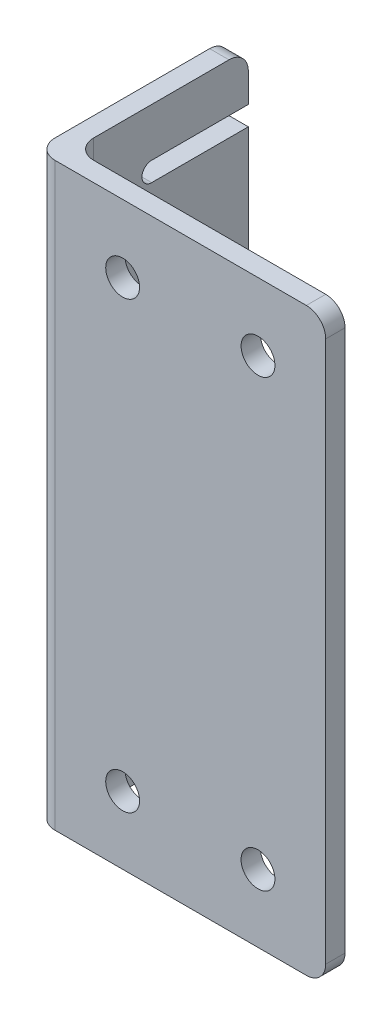
ISO-10303-21;
HEADER;
FILE_DESCRIPTION(('STEP AP214'),'2;1');
FILE_NAME('part.step','',(''),(''),'','','');
FILE_SCHEMA(('AUTOMOTIVE_DESIGN { 1 0 10303 214 1 1 1 1 }'));
ENDSEC;
DATA;
#1=APPLICATION_CONTEXT('core data for automotive mechanical design processes');
#2=APPLICATION_PROTOCOL_DEFINITION('international standard','automotive_design',2000,#1);
#3=PRODUCT_CONTEXT('',#1,'mechanical');
#4=PRODUCT('Part','Part','',(#3));
#5=PRODUCT_RELATED_PRODUCT_CATEGORY('part','',(#4));
#6=PRODUCT_DEFINITION_FORMATION('','',#4);
#7=PRODUCT_DEFINITION_CONTEXT('part definition',#1,'design');
#8=PRODUCT_DEFINITION('design','',#6,#7);
#9=PRODUCT_DEFINITION_SHAPE('','',#8);
#10=(LENGTH_UNIT() NAMED_UNIT(*) SI_UNIT(.MILLI.,.METRE.));
#11=(NAMED_UNIT(*) PLANE_ANGLE_UNIT() SI_UNIT($,.RADIAN.));
#12=(NAMED_UNIT(*) SI_UNIT($,.STERADIAN.) SOLID_ANGLE_UNIT());
#13=UNCERTAINTY_MEASURE_WITH_UNIT(LENGTH_MEASURE(1.E-05),#10,'distance_accuracy_value','');
#14=(GEOMETRIC_REPRESENTATION_CONTEXT(3) GLOBAL_UNCERTAINTY_ASSIGNED_CONTEXT((#13)) GLOBAL_UNIT_ASSIGNED_CONTEXT((#10,
#11,#12)) REPRESENTATION_CONTEXT('',''));
#15=CARTESIAN_POINT('',(0.,0.,0.));
#16=DIRECTION('',(0.,0.,1.));
#17=DIRECTION('',(1.,0.,0.));
#18=AXIS2_PLACEMENT_3D('',#15,#16,#17);
#19=CARTESIAN_POINT('',(0.,60.,-20.));
#20=DIRECTION('',(0.,0.,1.));
#21=DIRECTION('',(1.,0.,0.));
#22=AXIS2_PLACEMENT_3D('',#19,#20,#21);
#23=PLANE('',#22);
#24=DIRECTION('',(0.,-1.,0.));
#25=VECTOR('',#24,1.);
#26=CARTESIAN_POINT('',(0.,60.,-20.));
#27=LINE('',#26,#25);
#28=CARTESIAN_POINT('',(0.,58.,-20.));
#29=VERTEX_POINT('',#28);
#30=CARTESIAN_POINT('',(0.,55.,-20.));
#31=VERTEX_POINT('',#30);
#32=EDGE_CURVE('E299',#29,#31,#27,.T.);
#33=ORIENTED_EDGE('',*,*,#32,.F.);
#34=DIRECTION('',(-1.,0.,0.));
#35=VECTOR('',#34,1.);
#36=CARTESIAN_POINT('',(0.,58.,-20.));
#37=LINE('',#36,#35);
#38=CARTESIAN_POINT('',(2.,58.,-20.));
#39=VERTEX_POINT('',#38);
#40=EDGE_CURVE('E378',#29,#39,#37,.F.);
#41=ORIENTED_EDGE('',*,*,#40,.T.);
#42=DIRECTION('',(0.,-1.,0.));
#43=VECTOR('',#42,1.);
#44=CARTESIAN_POINT('',(2.,60.,-20.));
#45=LINE('',#44,#43);
#46=CARTESIAN_POINT('',(2.,55.,-20.));
#47=VERTEX_POINT('',#46);
#48=EDGE_CURVE('E304',#39,#47,#45,.T.);
#49=ORIENTED_EDGE('',*,*,#48,.T.);
#50=DIRECTION('',(-1.,0.,0.));
#51=VECTOR('',#50,1.);
#52=CARTESIAN_POINT('',(30.,55.,-20.));
#53=LINE('',#52,#51);
#54=EDGE_CURVE('E211',#47,#31,#53,.T.);
#55=ORIENTED_EDGE('',*,*,#54,.T.);
#56=EDGE_LOOP('',(#33,#41,#49,#55));
#57=FACE_BOUND('',#56,.T.);
#58=ADVANCED_FACE('F38',(#57),#23,.F.);
#59=CARTESIAN_POINT('',(0.,53.,-20.));
#60=VERTEX_POINT('',#59);
#61=CARTESIAN_POINT('',(0.,7.,-20.));
#62=VERTEX_POINT('',#61);
#63=EDGE_CURVE('E303',#60,#62,#27,.T.);
#64=ORIENTED_EDGE('',*,*,#63,.F.);
#65=DIRECTION('',(-1.,0.,0.));
#66=VECTOR('',#65,1.);
#67=CARTESIAN_POINT('',(30.,53.,-20.));
#68=LINE('',#67,#66);
#69=CARTESIAN_POINT('',(2.,53.,-20.));
#70=VERTEX_POINT('',#69);
#71=EDGE_CURVE('E191',#70,#60,#68,.T.);
#72=ORIENTED_EDGE('',*,*,#71,.F.);
#73=CARTESIAN_POINT('',(2.,7.,-20.));
#74=VERTEX_POINT('',#73);
#75=EDGE_CURVE('E308',#70,#74,#45,.T.);
#76=ORIENTED_EDGE('',*,*,#75,.T.);
#77=DIRECTION('',(-1.,0.,0.));
#78=VECTOR('',#77,1.);
#79=CARTESIAN_POINT('',(30.,7.,-20.));
#80=LINE('',#79,#78);
#81=EDGE_CURVE('E200',#74,#62,#80,.T.);
#82=ORIENTED_EDGE('',*,*,#81,.T.);
#83=EDGE_LOOP('',(#64,#72,#76,#82));
#84=FACE_BOUND('',#83,.T.);
#85=ADVANCED_FACE('F411',(#84),#23,.F.);
#86=CARTESIAN_POINT('',(30.,60.,-2.));
#87=DIRECTION('',(-1.,0.,0.));
#88=DIRECTION('',(0.,0.,1.));
#89=AXIS2_PLACEMENT_3D('',#86,#87,#88);
#90=PLANE('',#89);
#91=DIRECTION('',(0.,-1.,0.));
#92=VECTOR('',#91,1.);
#93=CARTESIAN_POINT('',(30.,60.,0.));
#94=LINE('',#93,#92);
#95=CARTESIAN_POINT('',(30.,58.,0.));
#96=VERTEX_POINT('',#95);
#97=CARTESIAN_POINT('',(30.,2.00000000000002,0.));
#98=VERTEX_POINT('',#97);
#99=EDGE_CURVE('E281',#96,#98,#94,.T.);
#100=ORIENTED_EDGE('',*,*,#99,.T.);
#101=DIRECTION('',(0.,0.,-1.));
#102=VECTOR('',#101,1.);
#103=CARTESIAN_POINT('',(30.,2.,-2.));
#104=LINE('',#103,#102);
#105=CARTESIAN_POINT('',(30.,2.00000000000002,-2.));
#106=VERTEX_POINT('',#105);
#107=EDGE_CURVE('E370',#98,#106,#104,.T.);
#108=ORIENTED_EDGE('',*,*,#107,.T.);
#109=DIRECTION('',(0.,-1.,0.));
#110=VECTOR('',#109,1.);
#111=CARTESIAN_POINT('',(30.,60.,-2.));
#112=LINE('',#111,#110);
#113=CARTESIAN_POINT('',(30.,58.,-2.));
#114=VERTEX_POINT('',#113);
#115=EDGE_CURVE('E307',#114,#106,#112,.T.);
#116=ORIENTED_EDGE('',*,*,#115,.F.);
#117=DIRECTION('',(0.,0.,-1.));
#118=VECTOR('',#117,1.);
#119=CARTESIAN_POINT('',(30.,58.,-2.));
#120=LINE('',#119,#118);
#121=EDGE_CURVE('E367',#114,#96,#120,.F.);
#122=ORIENTED_EDGE('',*,*,#121,.T.);
#123=EDGE_LOOP('',(#100,#108,#116,#122));
#124=FACE_BOUND('',#123,.T.);
#125=ADVANCED_FACE('F457',(#124),#90,.F.);
#126=CARTESIAN_POINT('',(2.,60.,-2.));
#127=DIRECTION('',(0.,0.,1.));
#128=DIRECTION('',(1.,0.,0.));
#129=AXIS2_PLACEMENT_3D('',#126,#127,#128);
#130=PLANE('',#129);
#131=CARTESIAN_POINT('',(23.,7.,-2.));
#132=DIRECTION('',(0.,0.,-1.));
#133=DIRECTION('',(-1.,0.,0.));
#134=AXIS2_PLACEMENT_3D('',#131,#132,#133);
#135=CIRCLE('',#134,1.75);
#136=CARTESIAN_POINT('',(21.25,7.,-2.));
#137=VERTEX_POINT('',#136);
#138=EDGE_CURVE('E663',#137,#137,#135,.T.);
#139=ORIENTED_EDGE('',*,*,#138,.F.);
#140=EDGE_LOOP('',(#139));
#141=FACE_BOUND('',#140,.T.);
#142=CARTESIAN_POINT('',(9.00000000000001,7.,-2.));
#143=DIRECTION('',(0.,0.,-1.));
#144=DIRECTION('',(-1.,0.,0.));
#145=AXIS2_PLACEMENT_3D('',#142,#143,#144);
#146=CIRCLE('',#145,1.75);
#147=CARTESIAN_POINT('',(7.25,7.,-2.));
#148=VERTEX_POINT('',#147);
#149=EDGE_CURVE('E667',#148,#148,#146,.T.);
#150=ORIENTED_EDGE('',*,*,#149,.F.);
#151=EDGE_LOOP('',(#150));
#152=FACE_BOUND('',#151,.T.);
#153=CARTESIAN_POINT('',(9.00000000000001,53.,-2.));
#154=DIRECTION('',(0.,0.,-1.));
#155=DIRECTION('',(-1.,0.,0.));
#156=AXIS2_PLACEMENT_3D('',#153,#154,#155);
#157=CIRCLE('',#156,1.75);
#158=CARTESIAN_POINT('',(7.25,53.,-2.));
#159=VERTEX_POINT('',#158);
#160=EDGE_CURVE('E681',#159,#159,#157,.T.);
#161=ORIENTED_EDGE('',*,*,#160,.F.);
#162=EDGE_LOOP('',(#161));
#163=FACE_BOUND('',#162,.T.);
#164=CARTESIAN_POINT('',(23.,53.,-2.));
#165=DIRECTION('',(0.,0.,-1.));
#166=DIRECTION('',(-1.,0.,0.));
#167=AXIS2_PLACEMENT_3D('',#164,#165,#166);
#168=CIRCLE('',#167,1.75);
#169=CARTESIAN_POINT('',(21.25,53.,-2.));
#170=VERTEX_POINT('',#169);
#171=EDGE_CURVE('E673',#170,#170,#168,.T.);
#172=ORIENTED_EDGE('',*,*,#171,.F.);
#173=EDGE_LOOP('',(#172));
#174=FACE_BOUND('',#173,.T.);
#175=DIRECTION('',(-1.,0.,0.));
#176=VECTOR('',#175,1.);
#177=CARTESIAN_POINT('',(2.,0.,-2.));
#178=LINE('',#177,#176);
#179=CARTESIAN_POINT('',(28.,0.,-2.));
#180=VERTEX_POINT('',#179);
#181=CARTESIAN_POINT('',(4.,0.,-2.));
#182=VERTEX_POINT('',#181);
#183=EDGE_CURVE('E264',#180,#182,#178,.T.);
#184=ORIENTED_EDGE('',*,*,#183,.T.);
#185=DIRECTION('',(0.,-1.,0.));
#186=VECTOR('',#185,1.);
#187=CARTESIAN_POINT('',(4.,60.,-2.));
#188=LINE('',#187,#186);
#189=CARTESIAN_POINT('',(4.,60.,-2.));
#190=VERTEX_POINT('',#189);
#191=EDGE_CURVE('E328',#182,#190,#188,.F.);
#192=ORIENTED_EDGE('',*,*,#191,.T.);
#193=DIRECTION('',(-1.,0.,0.));
#194=VECTOR('',#193,1.);
#195=CARTESIAN_POINT('',(2.,60.,-2.));
#196=LINE('',#195,#194);
#197=CARTESIAN_POINT('',(28.,60.,-2.));
#198=VERTEX_POINT('',#197);
#199=EDGE_CURVE('E265',#198,#190,#196,.T.);
#200=ORIENTED_EDGE('',*,*,#199,.F.);
#201=CARTESIAN_POINT('',(28.,58.,-2.));
#202=DIRECTION('',(0.,0.,1.));
#203=DIRECTION('',(1.,0.,0.));
#204=AXIS2_PLACEMENT_3D('',#201,#202,#203);
#205=CIRCLE('',#204,2.);
#206=EDGE_CURVE('E322',#198,#114,#205,.F.);
#207=ORIENTED_EDGE('',*,*,#206,.T.);
#208=ORIENTED_EDGE('',*,*,#115,.T.);
#209=CARTESIAN_POINT('',(28.,2.,-2.));
#210=DIRECTION('',(0.,0.,1.));
#211=DIRECTION('',(1.,0.,0.));
#212=AXIS2_PLACEMENT_3D('',#209,#210,#211);
#213=CIRCLE('',#212,2.);
#214=EDGE_CURVE('E325',#106,#180,#213,.F.);
#215=ORIENTED_EDGE('',*,*,#214,.T.);
#216=EDGE_LOOP('',(#184,#192,#200,#207,#208,#215));
#217=FACE_BOUND('',#216,.T.);
#218=ADVANCED_FACE('F391',(#141,#152,#163,#174,#217),#130,.F.);
#219=CARTESIAN_POINT('',(2.,60.,-20.));
#220=DIRECTION('',(-1.,0.,0.));
#221=DIRECTION('',(0.,0.,1.));
#222=AXIS2_PLACEMENT_3D('',#219,#220,#221);
#223=PLANE('',#222);
#224=DIRECTION('',(0.,0.,-1.));
#225=VECTOR('',#224,1.);
#226=CARTESIAN_POINT('',(2.,60.,-20.));
#227=LINE('',#226,#225);
#228=CARTESIAN_POINT('',(2.,60.,-4.));
#229=VERTEX_POINT('',#228);
#230=CARTESIAN_POINT('',(2.,60.,-18.));
#231=VERTEX_POINT('',#230);
#232=EDGE_CURVE('E269',#229,#231,#227,.T.);
#233=ORIENTED_EDGE('',*,*,#232,.F.);
#234=DIRECTION('',(0.,-1.,0.));
#235=VECTOR('',#234,1.);
#236=CARTESIAN_POINT('',(2.,0.,-4.));
#237=LINE('',#236,#235);
#238=CARTESIAN_POINT('',(2.,0.,-4.));
#239=VERTEX_POINT('',#238);
#240=EDGE_CURVE('E318',#229,#239,#237,.T.);
#241=ORIENTED_EDGE('',*,*,#240,.T.);
#242=DIRECTION('',(0.,0.,-1.));
#243=VECTOR('',#242,1.);
#244=CARTESIAN_POINT('',(2.,0.,-20.));
#245=LINE('',#244,#243);
#246=CARTESIAN_POINT('',(2.,0.,-18.));
#247=VERTEX_POINT('',#246);
#248=EDGE_CURVE('E285',#239,#247,#245,.T.);
#249=ORIENTED_EDGE('',*,*,#248,.T.);
#250=CARTESIAN_POINT('',(2.,2.,-18.));
#251=DIRECTION('',(-1.,0.,0.));
#252=DIRECTION('',(0.,0.,1.));
#253=AXIS2_PLACEMENT_3D('',#250,#251,#252);
#254=CIRCLE('',#253,2.);
#255=CARTESIAN_POINT('',(2.,2.00000000000002,-20.));
#256=VERTEX_POINT('',#255);
#257=EDGE_CURVE('E315',#247,#256,#254,.F.);
#258=ORIENTED_EDGE('',*,*,#257,.T.);
#259=CARTESIAN_POINT('',(2.,5.,-20.));
#260=VERTEX_POINT('',#259);
#261=EDGE_CURVE('E302',#260,#256,#45,.T.);
#262=ORIENTED_EDGE('',*,*,#261,.F.);
#263=DIRECTION('',(0.,0.,1.));
#264=VECTOR('',#263,1.);
#265=CARTESIAN_POINT('',(2.,5.,-20.));
#266=LINE('',#265,#264);
#267=CARTESIAN_POINT('',(2.,5.,-10.));
#268=VERTEX_POINT('',#267);
#269=EDGE_CURVE('E215',#260,#268,#266,.T.);
#270=ORIENTED_EDGE('',*,*,#269,.T.);
#271=CARTESIAN_POINT('',(2.,6.,-10.));
#272=DIRECTION('',(-1.,0.,0.));
#273=DIRECTION('',(0.,0.,1.));
#274=AXIS2_PLACEMENT_3D('',#271,#272,#273);
#275=CIRCLE('',#274,0.999999999999999);
#276=CARTESIAN_POINT('',(2.,7.,-10.));
#277=VERTEX_POINT('',#276);
#278=EDGE_CURVE('E247',#268,#277,#275,.T.);
#279=ORIENTED_EDGE('',*,*,#278,.T.);
#280=DIRECTION('',(0.,0.,-1.));
#281=VECTOR('',#280,1.);
#282=CARTESIAN_POINT('',(2.,7.,-20.));
#283=LINE('',#282,#281);
#284=EDGE_CURVE('E251',#277,#74,#283,.T.);
#285=ORIENTED_EDGE('',*,*,#284,.T.);
#286=ORIENTED_EDGE('',*,*,#75,.F.);
#287=DIRECTION('',(0.,0.,1.));
#288=VECTOR('',#287,1.);
#289=CARTESIAN_POINT('',(2.,53.,-20.));
#290=LINE('',#289,#288);
#291=CARTESIAN_POINT('',(2.,53.,-10.));
#292=VERTEX_POINT('',#291);
#293=EDGE_CURVE('E255',#70,#292,#290,.T.);
#294=ORIENTED_EDGE('',*,*,#293,.T.);
#295=CARTESIAN_POINT('',(2.,54.,-10.));
#296=DIRECTION('',(-1.,0.,0.));
#297=DIRECTION('',(0.,0.,1.));
#298=AXIS2_PLACEMENT_3D('',#295,#296,#297);
#299=CIRCLE('',#298,1.);
#300=CARTESIAN_POINT('',(2.,55.,-10.));
#301=VERTEX_POINT('',#300);
#302=EDGE_CURVE('E186',#292,#301,#299,.T.);
#303=ORIENTED_EDGE('',*,*,#302,.T.);
#304=DIRECTION('',(0.,0.,-1.));
#305=VECTOR('',#304,1.);
#306=CARTESIAN_POINT('',(2.,55.,-20.));
#307=LINE('',#306,#305);
#308=EDGE_CURVE('E260',#301,#47,#307,.T.);
#309=ORIENTED_EDGE('',*,*,#308,.T.);
#310=ORIENTED_EDGE('',*,*,#48,.F.);
#311=CARTESIAN_POINT('',(2.,58.,-18.));
#312=DIRECTION('',(-1.,0.,0.));
#313=DIRECTION('',(0.,0.,1.));
#314=AXIS2_PLACEMENT_3D('',#311,#312,#313);
#315=CIRCLE('',#314,2.);
#316=EDGE_CURVE('E312',#39,#231,#315,.F.);
#317=ORIENTED_EDGE('',*,*,#316,.T.);
#318=EDGE_LOOP('',(#233,#241,#249,#258,#262,#270,#279,#285,#286,#294,#303,#309,#310,#317));
#319=FACE_BOUND('',#318,.T.);
#320=ADVANCED_FACE('F399',(#319),#223,.F.);
#321=ORIENTED_EDGE('',*,*,#261,.T.);
#322=DIRECTION('',(-1.,0.,0.));
#323=VECTOR('',#322,1.);
#324=CARTESIAN_POINT('',(0.,2.,-20.));
#325=LINE('',#324,#323);
#326=CARTESIAN_POINT('',(0.,2.00000000000002,-20.));
#327=VERTEX_POINT('',#326);
#328=EDGE_CURVE('E374',#256,#327,#325,.T.);
#329=ORIENTED_EDGE('',*,*,#328,.T.);
#330=CARTESIAN_POINT('',(0.,5.00000000000001,-20.));
#331=VERTEX_POINT('',#330);
#332=EDGE_CURVE('E298',#331,#327,#27,.T.);
#333=ORIENTED_EDGE('',*,*,#332,.F.);
#334=DIRECTION('',(-1.,0.,0.));
#335=VECTOR('',#334,1.);
#336=CARTESIAN_POINT('',(30.,5.,-20.));
#337=LINE('',#336,#335);
#338=EDGE_CURVE('E232',#260,#331,#337,.T.);
#339=ORIENTED_EDGE('',*,*,#338,.F.);
#340=EDGE_LOOP('',(#321,#329,#333,#339));
#341=FACE_BOUND('',#340,.T.);
#342=ADVANCED_FACE('F423',(#341),#23,.F.);
#343=CARTESIAN_POINT('',(0.,60.,0.));
#344=DIRECTION('',(1.,0.,0.));
#345=DIRECTION('',(0.,0.,-1.));
#346=AXIS2_PLACEMENT_3D('',#343,#344,#345);
#347=PLANE('',#346);
#348=DIRECTION('',(0.,0.,1.));
#349=VECTOR('',#348,1.);
#350=CARTESIAN_POINT('',(0.,0.,0.));
#351=LINE('',#350,#349);
#352=CARTESIAN_POINT('',(0.,0.,-18.));
#353=VERTEX_POINT('',#352);
#354=CARTESIAN_POINT('',(0.,0.,-2.));
#355=VERTEX_POINT('',#354);
#356=EDGE_CURVE('E289',#353,#355,#351,.T.);
#357=ORIENTED_EDGE('',*,*,#356,.T.);
#358=DIRECTION('',(0.,-1.,0.));
#359=VECTOR('',#358,1.);
#360=CARTESIAN_POINT('',(0.,60.,-2.));
#361=LINE('',#360,#359);
#362=CARTESIAN_POINT('',(0.,60.,-2.));
#363=VERTEX_POINT('',#362);
#364=EDGE_CURVE('E54',#355,#363,#361,.F.);
#365=ORIENTED_EDGE('',*,*,#364,.T.);
#366=DIRECTION('',(0.,0.,1.));
#367=VECTOR('',#366,1.);
#368=CARTESIAN_POINT('',(0.,60.,0.));
#369=LINE('',#368,#367);
#370=CARTESIAN_POINT('',(0.,60.,-18.));
#371=VERTEX_POINT('',#370);
#372=EDGE_CURVE('E274',#371,#363,#369,.T.);
#373=ORIENTED_EDGE('',*,*,#372,.F.);
#374=CARTESIAN_POINT('',(0.,58.,-18.));
#375=DIRECTION('',(1.,0.,0.));
#376=DIRECTION('',(0.,0.,-1.));
#377=AXIS2_PLACEMENT_3D('',#374,#375,#376);
#378=CIRCLE('',#377,2.);
#379=EDGE_CURVE('E62',#371,#29,#378,.F.);
#380=ORIENTED_EDGE('',*,*,#379,.T.);
#381=ORIENTED_EDGE('',*,*,#32,.T.);
#382=DIRECTION('',(0.,0.,-1.));
#383=VECTOR('',#382,1.);
#384=CARTESIAN_POINT('',(0.,55.,-20.));
#385=LINE('',#384,#383);
#386=CARTESIAN_POINT('',(0.,55.,-10.));
#387=VERTEX_POINT('',#386);
#388=EDGE_CURVE('E204',#387,#31,#385,.T.);
#389=ORIENTED_EDGE('',*,*,#388,.F.);
#390=CARTESIAN_POINT('',(0.,54.,-10.));
#391=DIRECTION('',(-1.,0.,0.));
#392=DIRECTION('',(0.,0.,1.));
#393=AXIS2_PLACEMENT_3D('',#390,#391,#392);
#394=CIRCLE('',#393,1.);
#395=CARTESIAN_POINT('',(0.,53.,-10.));
#396=VERTEX_POINT('',#395);
#397=EDGE_CURVE('E183',#396,#387,#394,.T.);
#398=ORIENTED_EDGE('',*,*,#397,.F.);
#399=DIRECTION('',(0.,0.,1.));
#400=VECTOR('',#399,1.);
#401=CARTESIAN_POINT('',(0.,53.,-20.));
#402=LINE('',#401,#400);
#403=EDGE_CURVE('E194',#60,#396,#402,.T.);
#404=ORIENTED_EDGE('',*,*,#403,.F.);
#405=ORIENTED_EDGE('',*,*,#63,.T.);
#406=DIRECTION('',(0.,0.,-1.));
#407=VECTOR('',#406,1.);
#408=CARTESIAN_POINT('',(0.,7.,-20.));
#409=LINE('',#408,#407);
#410=CARTESIAN_POINT('',(0.,7.,-10.));
#411=VERTEX_POINT('',#410);
#412=EDGE_CURVE('E229',#411,#62,#409,.T.);
#413=ORIENTED_EDGE('',*,*,#412,.F.);
#414=CARTESIAN_POINT('',(0.,6.,-10.));
#415=DIRECTION('',(-1.,0.,0.));
#416=DIRECTION('',(0.,0.,1.));
#417=AXIS2_PLACEMENT_3D('',#414,#415,#416);
#418=CIRCLE('',#417,0.999999999999999);
#419=CARTESIAN_POINT('',(0.,5.,-10.));
#420=VERTEX_POINT('',#419);
#421=EDGE_CURVE('E224',#420,#411,#418,.T.);
#422=ORIENTED_EDGE('',*,*,#421,.F.);
#423=DIRECTION('',(0.,0.,1.));
#424=VECTOR('',#423,1.);
#425=CARTESIAN_POINT('',(0.,5.,-20.));
#426=LINE('',#425,#424);
#427=EDGE_CURVE('E220',#331,#420,#426,.T.);
#428=ORIENTED_EDGE('',*,*,#427,.F.);
#429=ORIENTED_EDGE('',*,*,#332,.T.);
#430=CARTESIAN_POINT('',(0.,2.,-18.));
#431=DIRECTION('',(1.,0.,0.));
#432=DIRECTION('',(0.,0.,-1.));
#433=AXIS2_PLACEMENT_3D('',#430,#431,#432);
#434=CIRCLE('',#433,2.);
#435=EDGE_CURVE('E352',#327,#353,#434,.F.);
#436=ORIENTED_EDGE('',*,*,#435,.T.);
#437=EDGE_LOOP('',(#357,#365,#373,#380,#381,#389,#398,#404,#405,#413,#422,#428,#429,#436));
#438=FACE_BOUND('',#437,.T.);
#439=ADVANCED_FACE('F202',(#438),#347,.F.);
#440=CARTESIAN_POINT('',(30.,60.,0.));
#441=DIRECTION('',(0.,0.,-1.));
#442=DIRECTION('',(-1.,0.,0.));
#443=AXIS2_PLACEMENT_3D('',#440,#441,#442);
#444=PLANE('',#443);
#445=CARTESIAN_POINT('',(23.,7.,0.));
#446=DIRECTION('',(0.,0.,-1.));
#447=DIRECTION('',(-1.,0.,0.));
#448=AXIS2_PLACEMENT_3D('',#445,#446,#447);
#449=CIRCLE('',#448,1.75);
#450=CARTESIAN_POINT('',(21.25,7.,0.));
#451=VERTEX_POINT('',#450);
#452=EDGE_CURVE('E660',#451,#451,#449,.T.);
#453=ORIENTED_EDGE('',*,*,#452,.T.);
#454=EDGE_LOOP('',(#453));
#455=FACE_BOUND('',#454,.T.);
#456=CARTESIAN_POINT('',(9.00000000000001,7.,0.));
#457=DIRECTION('',(0.,0.,-1.));
#458=DIRECTION('',(-1.,0.,0.));
#459=AXIS2_PLACEMENT_3D('',#456,#457,#458);
#460=CIRCLE('',#459,1.75);
#461=CARTESIAN_POINT('',(7.25,7.,0.));
#462=VERTEX_POINT('',#461);
#463=EDGE_CURVE('E687',#462,#462,#460,.T.);
#464=ORIENTED_EDGE('',*,*,#463,.T.);
#465=EDGE_LOOP('',(#464));
#466=FACE_BOUND('',#465,.T.);
#467=CARTESIAN_POINT('',(9.00000000000001,53.,0.));
#468=DIRECTION('',(0.,0.,-1.));
#469=DIRECTION('',(-1.,0.,0.));
#470=AXIS2_PLACEMENT_3D('',#467,#468,#469);
#471=CIRCLE('',#470,1.75);
#472=CARTESIAN_POINT('',(7.25,53.,0.));
#473=VERTEX_POINT('',#472);
#474=EDGE_CURVE('E676',#473,#473,#471,.T.);
#475=ORIENTED_EDGE('',*,*,#474,.T.);
#476=EDGE_LOOP('',(#475));
#477=FACE_BOUND('',#476,.T.);
#478=CARTESIAN_POINT('',(23.,53.,0.));
#479=DIRECTION('',(0.,0.,-1.));
#480=DIRECTION('',(-1.,0.,0.));
#481=AXIS2_PLACEMENT_3D('',#478,#479,#480);
#482=CIRCLE('',#481,1.75);
#483=CARTESIAN_POINT('',(21.25,53.,0.));
#484=VERTEX_POINT('',#483);
#485=EDGE_CURVE('E225',#484,#484,#482,.T.);
#486=ORIENTED_EDGE('',*,*,#485,.T.);
#487=EDGE_LOOP('',(#486));
#488=FACE_BOUND('',#487,.T.);
#489=DIRECTION('',(1.,0.,0.));
#490=VECTOR('',#489,1.);
#491=CARTESIAN_POINT('',(30.,60.,0.));
#492=LINE('',#491,#490);
#493=CARTESIAN_POINT('',(2.,60.,0.));
#494=VERTEX_POINT('',#493);
#495=CARTESIAN_POINT('',(28.,60.,0.));
#496=VERTEX_POINT('',#495);
#497=EDGE_CURVE('E277',#494,#496,#492,.T.);
#498=ORIENTED_EDGE('',*,*,#497,.F.);
#499=DIRECTION('',(0.,-1.,0.));
#500=VECTOR('',#499,1.);
#501=CARTESIAN_POINT('',(2.,60.,0.));
#502=LINE('',#501,#500);
#503=CARTESIAN_POINT('',(2.,0.,0.));
#504=VERTEX_POINT('',#503);
#505=EDGE_CURVE('E337',#494,#504,#502,.T.);
#506=ORIENTED_EDGE('',*,*,#505,.T.);
#507=DIRECTION('',(1.,0.,0.));
#508=VECTOR('',#507,1.);
#509=CARTESIAN_POINT('',(30.,0.,0.));
#510=LINE('',#509,#508);
#511=CARTESIAN_POINT('',(28.,0.,0.));
#512=VERTEX_POINT('',#511);
#513=EDGE_CURVE('E270',#504,#512,#510,.T.);
#514=ORIENTED_EDGE('',*,*,#513,.T.);
#515=CARTESIAN_POINT('',(28.,2.,0.));
#516=DIRECTION('',(0.,0.,-1.));
#517=DIRECTION('',(-1.,0.,0.));
#518=AXIS2_PLACEMENT_3D('',#515,#516,#517);
#519=CIRCLE('',#518,2.);
#520=EDGE_CURVE('E334',#512,#98,#519,.F.);
#521=ORIENTED_EDGE('',*,*,#520,.T.);
#522=ORIENTED_EDGE('',*,*,#99,.F.);
#523=CARTESIAN_POINT('',(28.,58.,0.));
#524=DIRECTION('',(0.,0.,-1.));
#525=DIRECTION('',(-1.,0.,0.));
#526=AXIS2_PLACEMENT_3D('',#523,#524,#525);
#527=CIRCLE('',#526,2.);
#528=EDGE_CURVE('E331',#96,#496,#527,.F.);
#529=ORIENTED_EDGE('',*,*,#528,.T.);
#530=EDGE_LOOP('',(#498,#506,#514,#521,#522,#529));
#531=FACE_BOUND('',#530,.T.);
#532=ADVANCED_FACE('F465',(#455,#466,#477,#488,#531),#444,.F.);
#533=CARTESIAN_POINT('',(0.,60.,0.));
#534=DIRECTION('',(0.,-1.,0.));
#535=DIRECTION('',(0.,0.,-1.));
#536=AXIS2_PLACEMENT_3D('',#533,#534,#535);
#537=PLANE('',#536);
#538=ORIENTED_EDGE('',*,*,#372,.T.);
#539=CARTESIAN_POINT('',(2.,60.,-2.));
#540=DIRECTION('',(0.,-1.,0.));
#541=DIRECTION('',(0.,0.,-1.));
#542=AXIS2_PLACEMENT_3D('',#539,#540,#541);
#543=CIRCLE('',#542,2.);
#544=EDGE_CURVE('E364',#363,#494,#543,.F.);
#545=ORIENTED_EDGE('',*,*,#544,.T.);
#546=ORIENTED_EDGE('',*,*,#497,.T.);
#547=DIRECTION('',(0.,0.,-1.));
#548=VECTOR('',#547,1.);
#549=CARTESIAN_POINT('',(28.,60.,0.));
#550=LINE('',#549,#548);
#551=EDGE_CURVE('E360',#496,#198,#550,.T.);
#552=ORIENTED_EDGE('',*,*,#551,.T.);
#553=ORIENTED_EDGE('',*,*,#199,.T.);
#554=CARTESIAN_POINT('',(4.,60.,-4.));
#555=DIRECTION('',(0.,-1.,0.));
#556=DIRECTION('',(0.,0.,-1.));
#557=AXIS2_PLACEMENT_3D('',#554,#555,#556);
#558=CIRCLE('',#557,2.);
#559=EDGE_CURVE('E11',#190,#229,#558,.T.);
#560=ORIENTED_EDGE('',*,*,#559,.T.);
#561=ORIENTED_EDGE('',*,*,#232,.T.);
#562=DIRECTION('',(-1.,0.,0.));
#563=VECTOR('',#562,1.);
#564=CARTESIAN_POINT('',(0.,60.,-18.));
#565=LINE('',#564,#563);
#566=EDGE_CURVE('E357',#231,#371,#565,.T.);
#567=ORIENTED_EDGE('',*,*,#566,.T.);
#568=EDGE_LOOP('',(#538,#545,#546,#552,#553,#560,#561,#567));
#569=FACE_BOUND('',#568,.T.);
#570=ADVANCED_FACE('F397',(#569),#537,.F.);
#571=CARTESIAN_POINT('',(0.,0.,0.));
#572=DIRECTION('',(0.,-1.,0.));
#573=DIRECTION('',(0.,0.,-1.));
#574=AXIS2_PLACEMENT_3D('',#571,#572,#573);
#575=PLANE('',#574);
#576=ORIENTED_EDGE('',*,*,#513,.F.);
#577=CARTESIAN_POINT('',(2.,0.,-2.));
#578=DIRECTION('',(0.,-1.,0.));
#579=DIRECTION('',(0.,0.,-1.));
#580=AXIS2_PLACEMENT_3D('',#577,#578,#579);
#581=CIRCLE('',#580,2.);
#582=EDGE_CURVE('E347',#504,#355,#581,.T.);
#583=ORIENTED_EDGE('',*,*,#582,.T.);
#584=ORIENTED_EDGE('',*,*,#356,.F.);
#585=DIRECTION('',(-1.,0.,0.));
#586=VECTOR('',#585,1.);
#587=CARTESIAN_POINT('',(2.,0.,-18.));
#588=LINE('',#587,#586);
#589=EDGE_CURVE('E341',#353,#247,#588,.F.);
#590=ORIENTED_EDGE('',*,*,#589,.T.);
#591=ORIENTED_EDGE('',*,*,#248,.F.);
#592=CARTESIAN_POINT('',(4.,0.,-4.));
#593=DIRECTION('',(0.,-1.,0.));
#594=DIRECTION('',(0.,0.,-1.));
#595=AXIS2_PLACEMENT_3D('',#592,#593,#594);
#596=CIRCLE('',#595,2.);
#597=EDGE_CURVE('E47',#239,#182,#596,.F.);
#598=ORIENTED_EDGE('',*,*,#597,.T.);
#599=ORIENTED_EDGE('',*,*,#183,.F.);
#600=DIRECTION('',(0.,0.,-1.));
#601=VECTOR('',#600,1.);
#602=CARTESIAN_POINT('',(28.,0.,0.));
#603=LINE('',#602,#601);
#604=EDGE_CURVE('E344',#180,#512,#603,.F.);
#605=ORIENTED_EDGE('',*,*,#604,.T.);
#606=EDGE_LOOP('',(#576,#583,#584,#590,#591,#598,#599,#605));
#607=FACE_BOUND('',#606,.T.);
#608=ADVANCED_FACE('F385',(#607),#575,.T.);
#609=CARTESIAN_POINT('',(30.,7.,-20.));
#610=DIRECTION('',(0.,1.,0.));
#611=DIRECTION('',(0.,0.,1.));
#612=AXIS2_PLACEMENT_3D('',#609,#610,#611);
#613=PLANE('',#612);
#614=DIRECTION('',(-1.,0.,0.));
#615=VECTOR('',#614,1.);
#616=CARTESIAN_POINT('',(30.,7.,-10.));
#617=LINE('',#616,#615);
#618=EDGE_CURVE('E236',#277,#411,#617,.T.);
#619=ORIENTED_EDGE('',*,*,#618,.T.);
#620=ORIENTED_EDGE('',*,*,#412,.T.);
#621=ORIENTED_EDGE('',*,*,#81,.F.);
#622=ORIENTED_EDGE('',*,*,#284,.F.);
#623=EDGE_LOOP('',(#619,#620,#621,#622));
#624=FACE_BOUND('',#623,.T.);
#625=ADVANCED_FACE('F439',(#624),#613,.F.);
#626=CARTESIAN_POINT('',(30.,6.,-10.));
#627=DIRECTION('',(-1.,0.,0.));
#628=DIRECTION('',(0.,0.,1.));
#629=AXIS2_PLACEMENT_3D('',#626,#627,#628);
#630=CYLINDRICAL_SURFACE('',#629,0.999999999999999);
#631=DIRECTION('',(-1.,0.,0.));
#632=VECTOR('',#631,1.);
#633=CARTESIAN_POINT('',(30.,5.,-10.));
#634=LINE('',#633,#632);
#635=EDGE_CURVE('E239',#268,#420,#634,.T.);
#636=ORIENTED_EDGE('',*,*,#635,.T.);
#637=ORIENTED_EDGE('',*,*,#421,.T.);
#638=ORIENTED_EDGE('',*,*,#618,.F.);
#639=ORIENTED_EDGE('',*,*,#278,.F.);
#640=EDGE_LOOP('',(#636,#637,#638,#639));
#641=FACE_BOUND('',#640,.T.);
#642=ADVANCED_FACE('F436',(#641),#630,.F.);
#643=CARTESIAN_POINT('',(30.,5.,-20.));
#644=DIRECTION('',(0.,-1.,0.));
#645=DIRECTION('',(0.,0.,-1.));
#646=AXIS2_PLACEMENT_3D('',#643,#644,#645);
#647=PLANE('',#646);
#648=ORIENTED_EDGE('',*,*,#338,.T.);
#649=ORIENTED_EDGE('',*,*,#427,.T.);
#650=ORIENTED_EDGE('',*,*,#635,.F.);
#651=ORIENTED_EDGE('',*,*,#269,.F.);
#652=EDGE_LOOP('',(#648,#649,#650,#651));
#653=FACE_BOUND('',#652,.T.);
#654=ADVANCED_FACE('F434',(#653),#647,.F.);
#655=CARTESIAN_POINT('',(30.,55.,-20.));
#656=DIRECTION('',(0.,1.,0.));
#657=DIRECTION('',(0.,0.,1.));
#658=AXIS2_PLACEMENT_3D('',#655,#656,#657);
#659=PLANE('',#658);
#660=DIRECTION('',(-1.,0.,0.));
#661=VECTOR('',#660,1.);
#662=CARTESIAN_POINT('',(30.,55.,-10.));
#663=LINE('',#662,#661);
#664=EDGE_CURVE('E190',#301,#387,#663,.T.);
#665=ORIENTED_EDGE('',*,*,#664,.T.);
#666=ORIENTED_EDGE('',*,*,#388,.T.);
#667=ORIENTED_EDGE('',*,*,#54,.F.);
#668=ORIENTED_EDGE('',*,*,#308,.F.);
#669=EDGE_LOOP('',(#665,#666,#667,#668));
#670=FACE_BOUND('',#669,.T.);
#671=ADVANCED_FACE('F407',(#670),#659,.F.);
#672=CARTESIAN_POINT('',(30.,54.,-10.));
#673=DIRECTION('',(-1.,0.,0.));
#674=DIRECTION('',(0.,0.,1.));
#675=AXIS2_PLACEMENT_3D('',#672,#673,#674);
#676=CYLINDRICAL_SURFACE('',#675,1.);
#677=DIRECTION('',(-1.,0.,0.));
#678=VECTOR('',#677,1.);
#679=CARTESIAN_POINT('',(30.,53.,-10.));
#680=LINE('',#679,#678);
#681=EDGE_CURVE('E178',#292,#396,#680,.T.);
#682=ORIENTED_EDGE('',*,*,#681,.T.);
#683=ORIENTED_EDGE('',*,*,#397,.T.);
#684=ORIENTED_EDGE('',*,*,#664,.F.);
#685=ORIENTED_EDGE('',*,*,#302,.F.);
#686=EDGE_LOOP('',(#682,#683,#684,#685));
#687=FACE_BOUND('',#686,.T.);
#688=ADVANCED_FACE('F180',(#687),#676,.F.);
#689=CARTESIAN_POINT('',(30.,53.,-20.));
#690=DIRECTION('',(0.,-1.,0.));
#691=DIRECTION('',(0.,0.,-1.));
#692=AXIS2_PLACEMENT_3D('',#689,#690,#691);
#693=PLANE('',#692);
#694=ORIENTED_EDGE('',*,*,#71,.T.);
#695=ORIENTED_EDGE('',*,*,#403,.T.);
#696=ORIENTED_EDGE('',*,*,#681,.F.);
#697=ORIENTED_EDGE('',*,*,#293,.F.);
#698=EDGE_LOOP('',(#694,#695,#696,#697));
#699=FACE_BOUND('',#698,.T.);
#700=ADVANCED_FACE('F195',(#699),#693,.F.);
#701=CARTESIAN_POINT('',(23.,53.,0.));
#702=DIRECTION('',(0.,0.,-1.));
#703=DIRECTION('',(-1.,0.,0.));
#704=AXIS2_PLACEMENT_3D('',#701,#702,#703);
#705=CYLINDRICAL_SURFACE('',#704,1.75);
#706=ORIENTED_EDGE('',*,*,#485,.F.);
#707=EDGE_LOOP('',(#706));
#708=FACE_BOUND('',#707,.T.);
#709=ORIENTED_EDGE('',*,*,#171,.T.);
#710=EDGE_LOOP('',(#709));
#711=FACE_BOUND('',#710,.T.);
#712=ADVANCED_FACE('F616',(#708,#711),#705,.F.);
#713=CARTESIAN_POINT('',(9.00000000000001,53.,0.));
#714=DIRECTION('',(0.,0.,-1.));
#715=DIRECTION('',(-1.,0.,0.));
#716=AXIS2_PLACEMENT_3D('',#713,#714,#715);
#717=CYLINDRICAL_SURFACE('',#716,1.75);
#718=ORIENTED_EDGE('',*,*,#474,.F.);
#719=EDGE_LOOP('',(#718));
#720=FACE_BOUND('',#719,.T.);
#721=ORIENTED_EDGE('',*,*,#160,.T.);
#722=EDGE_LOOP('',(#721));
#723=FACE_BOUND('',#722,.T.);
#724=ADVANCED_FACE('F623',(#720,#723),#717,.F.);
#725=CARTESIAN_POINT('',(9.00000000000001,7.,0.));
#726=DIRECTION('',(0.,0.,-1.));
#727=DIRECTION('',(-1.,0.,0.));
#728=AXIS2_PLACEMENT_3D('',#725,#726,#727);
#729=CYLINDRICAL_SURFACE('',#728,1.75);
#730=ORIENTED_EDGE('',*,*,#463,.F.);
#731=EDGE_LOOP('',(#730));
#732=FACE_BOUND('',#731,.T.);
#733=ORIENTED_EDGE('',*,*,#149,.T.);
#734=EDGE_LOOP('',(#733));
#735=FACE_BOUND('',#734,.T.);
#736=ADVANCED_FACE('F632',(#732,#735),#729,.F.);
#737=CARTESIAN_POINT('',(23.,7.,0.));
#738=DIRECTION('',(0.,0.,-1.));
#739=DIRECTION('',(-1.,0.,0.));
#740=AXIS2_PLACEMENT_3D('',#737,#738,#739);
#741=CYLINDRICAL_SURFACE('',#740,1.75);
#742=ORIENTED_EDGE('',*,*,#452,.F.);
#743=EDGE_LOOP('',(#742));
#744=FACE_BOUND('',#743,.T.);
#745=ORIENTED_EDGE('',*,*,#138,.T.);
#746=EDGE_LOOP('',(#745));
#747=FACE_BOUND('',#746,.T.);
#748=ADVANCED_FACE('F477',(#744,#747),#741,.F.);
#749=CARTESIAN_POINT('',(4.,60.,-4.));
#750=DIRECTION('',(0.,1.,0.));
#751=DIRECTION('',(0.,0.,1.));
#752=AXIS2_PLACEMENT_3D('',#749,#750,#751);
#753=CYLINDRICAL_SURFACE('',#752,2.);
#754=ORIENTED_EDGE('',*,*,#559,.F.);
#755=ORIENTED_EDGE('',*,*,#191,.F.);
#756=ORIENTED_EDGE('',*,*,#597,.F.);
#757=ORIENTED_EDGE('',*,*,#240,.F.);
#758=EDGE_LOOP('',(#754,#755,#756,#757));
#759=FACE_BOUND('',#758,.T.);
#760=ADVANCED_FACE('F394',(#759),#753,.F.);
#761=CARTESIAN_POINT('',(2.,60.,-2.));
#762=DIRECTION('',(0.,-1.,0.));
#763=DIRECTION('',(0.,0.,-1.));
#764=AXIS2_PLACEMENT_3D('',#761,#762,#763);
#765=CYLINDRICAL_SURFACE('',#764,2.);
#766=ORIENTED_EDGE('',*,*,#544,.F.);
#767=ORIENTED_EDGE('',*,*,#364,.F.);
#768=ORIENTED_EDGE('',*,*,#582,.F.);
#769=ORIENTED_EDGE('',*,*,#505,.F.);
#770=EDGE_LOOP('',(#766,#767,#768,#769));
#771=FACE_BOUND('',#770,.T.);
#772=ADVANCED_FACE('F476',(#771),#765,.T.);
#773=CARTESIAN_POINT('',(28.,2.,-2.));
#774=DIRECTION('',(0.,0.,1.));
#775=DIRECTION('',(1.,0.,0.));
#776=AXIS2_PLACEMENT_3D('',#773,#774,#775);
#777=CYLINDRICAL_SURFACE('',#776,2.);
#778=ORIENTED_EDGE('',*,*,#520,.F.);
#779=ORIENTED_EDGE('',*,*,#604,.F.);
#780=ORIENTED_EDGE('',*,*,#214,.F.);
#781=ORIENTED_EDGE('',*,*,#107,.F.);
#782=EDGE_LOOP('',(#778,#779,#780,#781));
#783=FACE_BOUND('',#782,.T.);
#784=ADVANCED_FACE('F480',(#783),#777,.T.);
#785=CARTESIAN_POINT('',(28.,58.,0.));
#786=DIRECTION('',(0.,0.,-1.));
#787=DIRECTION('',(-1.,0.,0.));
#788=AXIS2_PLACEMENT_3D('',#785,#786,#787);
#789=CYLINDRICAL_SURFACE('',#788,2.);
#790=ORIENTED_EDGE('',*,*,#528,.F.);
#791=ORIENTED_EDGE('',*,*,#121,.F.);
#792=ORIENTED_EDGE('',*,*,#206,.F.);
#793=ORIENTED_EDGE('',*,*,#551,.F.);
#794=EDGE_LOOP('',(#790,#791,#792,#793));
#795=FACE_BOUND('',#794,.T.);
#796=ADVANCED_FACE('F484',(#795),#789,.T.);
#797=CARTESIAN_POINT('',(0.,2.,-18.));
#798=DIRECTION('',(1.,0.,0.));
#799=DIRECTION('',(0.,0.,-1.));
#800=AXIS2_PLACEMENT_3D('',#797,#798,#799);
#801=CYLINDRICAL_SURFACE('',#800,2.);
#802=ORIENTED_EDGE('',*,*,#257,.F.);
#803=ORIENTED_EDGE('',*,*,#589,.F.);
#804=ORIENTED_EDGE('',*,*,#435,.F.);
#805=ORIENTED_EDGE('',*,*,#328,.F.);
#806=EDGE_LOOP('',(#802,#803,#804,#805));
#807=FACE_BOUND('',#806,.T.);
#808=ADVANCED_FACE('F428',(#807),#801,.T.);
#809=CARTESIAN_POINT('',(0.,58.,-18.));
#810=DIRECTION('',(-1.,0.,0.));
#811=DIRECTION('',(0.,0.,1.));
#812=AXIS2_PLACEMENT_3D('',#809,#810,#811);
#813=CYLINDRICAL_SURFACE('',#812,2.);
#814=ORIENTED_EDGE('',*,*,#316,.F.);
#815=ORIENTED_EDGE('',*,*,#40,.F.);
#816=ORIENTED_EDGE('',*,*,#379,.F.);
#817=ORIENTED_EDGE('',*,*,#566,.F.);
#818=EDGE_LOOP('',(#814,#815,#816,#817));
#819=FACE_BOUND('',#818,.T.);
#820=ADVANCED_FACE('F40',(#819),#813,.T.);
#821=CLOSED_SHELL('',(#58,#85,#125,#218,#320,#342,#439,#532,#570,#608,#625,#642,#654,#671,#688,
#700,#712,#724,#736,#748,#760,#772,#784,#796,#808,#820));
#822=MANIFOLD_SOLID_BREP('B2',#821);
#823=ADVANCED_BREP_SHAPE_REPRESENTATION('',(#18,#822),#14);
#824=SHAPE_DEFINITION_REPRESENTATION(#9,#823);
ENDSEC;
END-ISO-10303-21;
